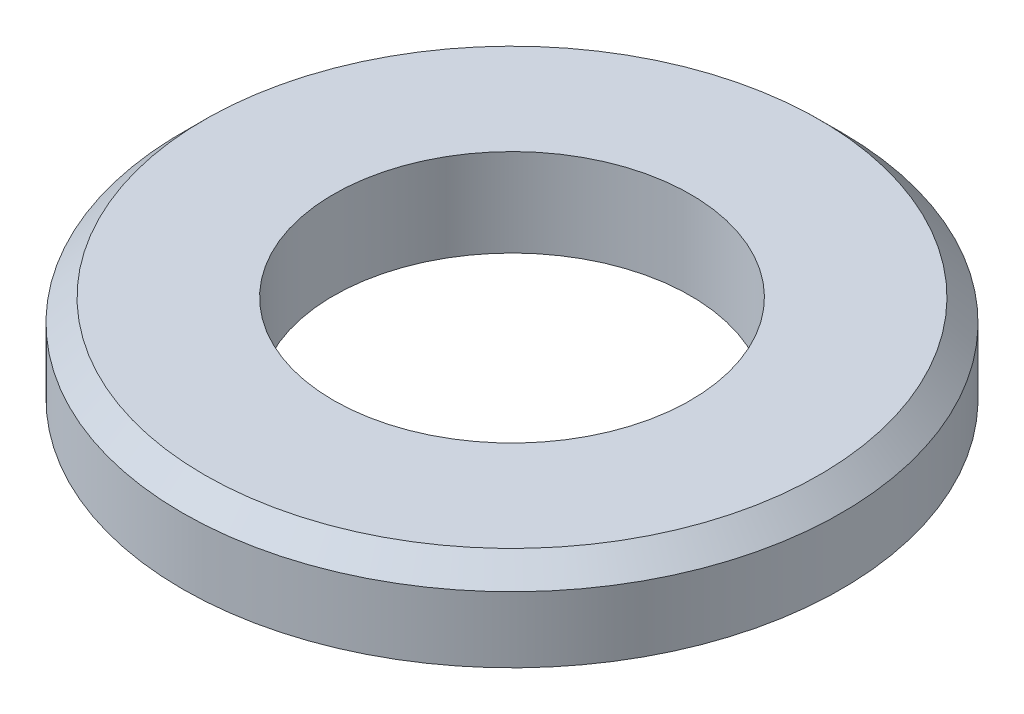
ISO-10303-21;
HEADER;
FILE_DESCRIPTION(('STEP AP214'),'2;1');
FILE_NAME('part.step','',(''),(''),'','','');
FILE_SCHEMA(('AUTOMOTIVE_DESIGN { 1 0 10303 214 1 1 1 1 }'));
ENDSEC;
DATA;
#1=APPLICATION_CONTEXT('core data for automotive mechanical design processes');
#2=APPLICATION_PROTOCOL_DEFINITION('international standard','automotive_design',2000,#1);
#3=PRODUCT_CONTEXT('',#1,'mechanical');
#4=PRODUCT('Part','Part','',(#3));
#5=PRODUCT_RELATED_PRODUCT_CATEGORY('part','',(#4));
#6=PRODUCT_DEFINITION_FORMATION('','',#4);
#7=PRODUCT_DEFINITION_CONTEXT('part definition',#1,'design');
#8=PRODUCT_DEFINITION('design','',#6,#7);
#9=PRODUCT_DEFINITION_SHAPE('','',#8);
#10=(LENGTH_UNIT() NAMED_UNIT(*) SI_UNIT(.MILLI.,.METRE.));
#11=(NAMED_UNIT(*) PLANE_ANGLE_UNIT() SI_UNIT($,.RADIAN.));
#12=(NAMED_UNIT(*) SI_UNIT($,.STERADIAN.) SOLID_ANGLE_UNIT());
#13=UNCERTAINTY_MEASURE_WITH_UNIT(LENGTH_MEASURE(1.E-05),#10,'distance_accuracy_value','');
#14=(GEOMETRIC_REPRESENTATION_CONTEXT(3) GLOBAL_UNCERTAINTY_ASSIGNED_CONTEXT((#13)) GLOBAL_UNIT_ASSIGNED_CONTEXT((#10,
#11,#12)) REPRESENTATION_CONTEXT('',''));
#15=CARTESIAN_POINT('',(0.,0.,0.));
#16=DIRECTION('',(0.,0.,1.));
#17=DIRECTION('',(1.,0.,0.));
#18=AXIS2_PLACEMENT_3D('',#15,#16,#17);
#19=CARTESIAN_POINT('',(0.,1.6,0.));
#20=DIRECTION('',(0.,1.,0.));
#21=DIRECTION('',(0.,0.,1.));
#22=AXIS2_PLACEMENT_3D('',#19,#20,#21);
#23=PLANE('',#22);
#24=CARTESIAN_POINT('',(0.,1.6,0.));
#25=DIRECTION('',(0.,1.,0.));
#26=DIRECTION('',(0.,0.,1.));
#27=AXIS2_PLACEMENT_3D('',#24,#25,#26);
#28=CIRCLE('',#27,5.6);
#29=CARTESIAN_POINT('',(0.,1.6,5.6));
#30=VERTEX_POINT('',#29);
#31=EDGE_CURVE('E43',#30,#30,#28,.T.);
#32=ORIENTED_EDGE('',*,*,#31,.T.);
#33=EDGE_LOOP('',(#32));
#34=FACE_BOUND('',#33,.T.);
#35=CARTESIAN_POINT('',(0.,1.6,0.));
#36=DIRECTION('',(0.,1.,0.));
#37=DIRECTION('',(0.,0.,1.));
#38=AXIS2_PLACEMENT_3D('',#35,#36,#37);
#39=CIRCLE('',#38,3.25);
#40=CARTESIAN_POINT('',(0.,1.6,3.25));
#41=VERTEX_POINT('',#40);
#42=EDGE_CURVE('E51',#41,#41,#39,.T.);
#43=ORIENTED_EDGE('',*,*,#42,.F.);
#44=EDGE_LOOP('',(#43));
#45=FACE_BOUND('',#44,.T.);
#46=ADVANCED_FACE('F35',(#34,#45),#23,.T.);
#47=CARTESIAN_POINT('',(0.,0.,0.));
#48=DIRECTION('',(0.,1.,0.));
#49=DIRECTION('',(0.,0.,1.));
#50=AXIS2_PLACEMENT_3D('',#47,#48,#49);
#51=PLANE('',#50);
#52=CARTESIAN_POINT('',(0.,0.,0.));
#53=DIRECTION('',(0.,1.,0.));
#54=DIRECTION('',(0.,0.,1.));
#55=AXIS2_PLACEMENT_3D('',#52,#53,#54);
#56=CIRCLE('',#55,6.);
#57=CARTESIAN_POINT('',(0.,0.,6.));
#58=VERTEX_POINT('',#57);
#59=EDGE_CURVE('E47',#58,#58,#56,.T.);
#60=ORIENTED_EDGE('',*,*,#59,.F.);
#61=EDGE_LOOP('',(#60));
#62=FACE_BOUND('',#61,.T.);
#63=CARTESIAN_POINT('',(0.,0.,0.));
#64=DIRECTION('',(0.,1.,0.));
#65=DIRECTION('',(0.,0.,1.));
#66=AXIS2_PLACEMENT_3D('',#63,#64,#65);
#67=CIRCLE('',#66,3.25);
#68=CARTESIAN_POINT('',(0.,0.,3.25));
#69=VERTEX_POINT('',#68);
#70=EDGE_CURVE('E54',#69,#69,#67,.T.);
#71=ORIENTED_EDGE('',*,*,#70,.T.);
#72=EDGE_LOOP('',(#71));
#73=FACE_BOUND('',#72,.T.);
#74=ADVANCED_FACE('F64',(#62,#73),#51,.F.);
#75=CARTESIAN_POINT('',(0.,1.6,0.));
#76=DIRECTION('',(0.,-1.,0.));
#77=DIRECTION('',(0.,0.,-1.));
#78=AXIS2_PLACEMENT_3D('',#75,#76,#77);
#79=CYLINDRICAL_SURFACE('',#78,6.);
#80=CARTESIAN_POINT('',(0.,1.19999999999999,0.));
#81=DIRECTION('',(0.,1.,0.));
#82=DIRECTION('',(0.,0.,1.));
#83=AXIS2_PLACEMENT_3D('',#80,#81,#82);
#84=CIRCLE('',#83,6.);
#85=CARTESIAN_POINT('',(0.,1.19999999999999,6.));
#86=VERTEX_POINT('',#85);
#87=EDGE_CURVE('E10',#86,#86,#84,.F.);
#88=ORIENTED_EDGE('',*,*,#87,.T.);
#89=EDGE_LOOP('',(#88));
#90=FACE_BOUND('',#89,.T.);
#91=ORIENTED_EDGE('',*,*,#59,.T.);
#92=EDGE_LOOP('',(#91));
#93=FACE_BOUND('',#92,.T.);
#94=ADVANCED_FACE('F69',(#90,#93),#79,.T.);
#95=CARTESIAN_POINT('',(0.,1.6,0.));
#96=DIRECTION('',(0.,-1.,0.));
#97=DIRECTION('',(0.,0.,-1.));
#98=AXIS2_PLACEMENT_3D('',#95,#96,#97);
#99=CYLINDRICAL_SURFACE('',#98,3.25);
#100=ORIENTED_EDGE('',*,*,#42,.T.);
#101=EDGE_LOOP('',(#100));
#102=FACE_BOUND('',#101,.T.);
#103=ORIENTED_EDGE('',*,*,#70,.F.);
#104=EDGE_LOOP('',(#103));
#105=FACE_BOUND('',#104,.T.);
#106=ADVANCED_FACE('F60',(#102,#105),#99,.F.);
#107=CARTESIAN_POINT('',(0.,1.6,0.));
#108=DIRECTION('',(0.,-1.,0.));
#109=DIRECTION('',(0.,0.,-1.));
#110=AXIS2_PLACEMENT_3D('',#107,#108,#109);
#111=CONICAL_SURFACE('',#110,5.6,0.785398163397441);
#112=ORIENTED_EDGE('',*,*,#87,.F.);
#113=EDGE_LOOP('',(#112));
#114=FACE_BOUND('',#113,.T.);
#115=ORIENTED_EDGE('',*,*,#31,.F.);
#116=EDGE_LOOP('',(#115));
#117=FACE_BOUND('',#116,.T.);
#118=ADVANCED_FACE('F38',(#114,#117),#111,.T.);
#119=CLOSED_SHELL('',(#46,#74,#94,#106,#118));
#120=MANIFOLD_SOLID_BREP('B2',#119);
#121=ADVANCED_BREP_SHAPE_REPRESENTATION('',(#18,#120),#14);
#122=SHAPE_DEFINITION_REPRESENTATION(#9,#121);
ENDSEC;
END-ISO-10303-21;
